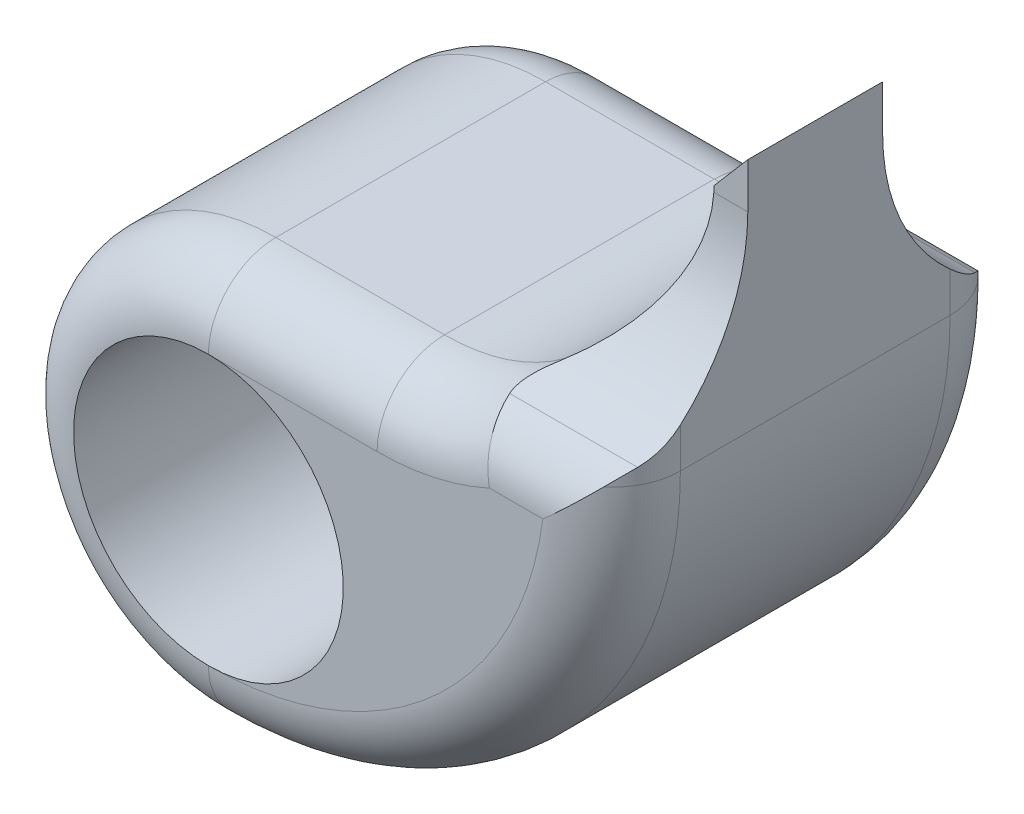
ISO-10303-21;
HEADER;
FILE_DESCRIPTION(('STEP AP214'),'2;1');
FILE_NAME('part.step','',(''),(''),'','','');
FILE_SCHEMA(('AUTOMOTIVE_DESIGN { 1 0 10303 214 1 1 1 1 }'));
ENDSEC;
DATA;
#1=APPLICATION_CONTEXT('core data for automotive mechanical design processes');
#2=APPLICATION_PROTOCOL_DEFINITION('international standard','automotive_design',2000,#1);
#3=PRODUCT_CONTEXT('',#1,'mechanical');
#4=PRODUCT('Part','Part','',(#3));
#5=PRODUCT_RELATED_PRODUCT_CATEGORY('part','',(#4));
#6=PRODUCT_DEFINITION_FORMATION('','',#4);
#7=PRODUCT_DEFINITION_CONTEXT('part definition',#1,'design');
#8=PRODUCT_DEFINITION('design','',#6,#7);
#9=PRODUCT_DEFINITION_SHAPE('','',#8);
#10=(LENGTH_UNIT() NAMED_UNIT(*) SI_UNIT(.MILLI.,.METRE.));
#11=(NAMED_UNIT(*) PLANE_ANGLE_UNIT() SI_UNIT($,.RADIAN.));
#12=(NAMED_UNIT(*) SI_UNIT($,.STERADIAN.) SOLID_ANGLE_UNIT());
#13=UNCERTAINTY_MEASURE_WITH_UNIT(LENGTH_MEASURE(1.E-05),#10,'distance_accuracy_value','');
#14=(GEOMETRIC_REPRESENTATION_CONTEXT(3) GLOBAL_UNCERTAINTY_ASSIGNED_CONTEXT((#13)) GLOBAL_UNIT_ASSIGNED_CONTEXT((#10,
#11,#12)) REPRESENTATION_CONTEXT('',''));
#15=CARTESIAN_POINT('',(0.,0.,0.));
#16=DIRECTION('',(0.,0.,1.));
#17=DIRECTION('',(1.,0.,0.));
#18=AXIS2_PLACEMENT_3D('',#15,#16,#17);
#19=CARTESIAN_POINT('',(6.,6.5,6.));
#20=DIRECTION('',(0.759515470248913,-0.65048923930575,0.));
#21=DIRECTION('',(0.65048923930575,0.759515470248913,0.));
#22=AXIS2_PLACEMENT_3D('',#19,#20,#21);
#23=PLANE('',#22);
#24=DIRECTION('',(0.65048923930575,0.759515470248913,0.));
#25=VECTOR('',#24,1.);
#26=CARTESIAN_POINT('',(6.,6.5,2.));
#27=LINE('',#26,#25);
#28=CARTESIAN_POINT('',(5.5,5.91619674519172,2.));
#29=VERTEX_POINT('',#28);
#30=CARTESIAN_POINT('',(6.,6.5,2.));
#31=VERTEX_POINT('',#30);
#32=EDGE_CURVE('E357',#29,#31,#27,.T.);
#33=ORIENTED_EDGE('',*,*,#32,.F.);
#34=DIRECTION('',(0.,0.,1.));
#35=VECTOR('',#34,1.);
#36=CARTESIAN_POINT('',(5.5,5.91619674519172,2.));
#37=LINE('',#36,#35);
#38=CARTESIAN_POINT('',(5.5,5.91619674519172,4.));
#39=VERTEX_POINT('',#38);
#40=EDGE_CURVE('E210',#29,#39,#37,.T.);
#41=ORIENTED_EDGE('',*,*,#40,.T.);
#42=DIRECTION('',(-0.65048923930575,-0.759515470248913,0.));
#43=VECTOR('',#42,1.);
#44=CARTESIAN_POINT('',(6.,6.5,4.));
#45=LINE('',#44,#43);
#46=CARTESIAN_POINT('',(6.,6.5,4.));
#47=VERTEX_POINT('',#46);
#48=EDGE_CURVE('E358',#47,#39,#45,.T.);
#49=ORIENTED_EDGE('',*,*,#48,.F.);
#50=DIRECTION('',(0.,0.,-1.));
#51=VECTOR('',#50,1.);
#52=CARTESIAN_POINT('',(6.,6.5,6.));
#53=LINE('',#52,#51);
#54=EDGE_CURVE('E254',#47,#31,#53,.T.);
#55=ORIENTED_EDGE('',*,*,#54,.T.);
#56=EDGE_LOOP('',(#33,#41,#49,#55));
#57=FACE_BOUND('',#56,.T.);
#58=ADVANCED_FACE('F36',(#57),#23,.F.);
#59=CARTESIAN_POINT('',(0.,3.,6.));
#60=DIRECTION('',(0.,-1.,0.));
#61=DIRECTION('',(0.,0.,-1.));
#62=AXIS2_PLACEMENT_3D('',#59,#60,#61);
#63=PLANE('',#62);
#64=DIRECTION('',(0.,0.,-1.));
#65=VECTOR('',#64,1.);
#66=CARTESIAN_POINT('',(2.50117072601931,3.,6.));
#67=LINE('',#66,#65);
#68=CARTESIAN_POINT('',(2.50117072601931,3.,5.));
#69=VERTEX_POINT('',#68);
#70=CARTESIAN_POINT('',(2.50117072601931,3.,1.));
#71=VERTEX_POINT('',#70);
#72=EDGE_CURVE('E288',#69,#71,#67,.T.);
#73=ORIENTED_EDGE('',*,*,#72,.T.);
#74=DIRECTION('',(-1.,0.,0.));
#75=VECTOR('',#74,1.);
#76=CARTESIAN_POINT('',(0.,3.,1.));
#77=LINE('',#76,#75);
#78=CARTESIAN_POINT('',(0.,3.,1.));
#79=VERTEX_POINT('',#78);
#80=EDGE_CURVE('E412',#71,#79,#77,.T.);
#81=ORIENTED_EDGE('',*,*,#80,.T.);
#82=DIRECTION('',(0.,0.,-1.));
#83=VECTOR('',#82,1.);
#84=CARTESIAN_POINT('',(0.,3.,6.));
#85=LINE('',#84,#83);
#86=CARTESIAN_POINT('',(0.,3.,5.));
#87=VERTEX_POINT('',#86);
#88=EDGE_CURVE('E279',#87,#79,#85,.T.);
#89=ORIENTED_EDGE('',*,*,#88,.F.);
#90=DIRECTION('',(-1.,0.,0.));
#91=VECTOR('',#90,1.);
#92=CARTESIAN_POINT('',(0.,3.,5.));
#93=LINE('',#92,#91);
#94=EDGE_CURVE('E404',#87,#69,#93,.F.);
#95=ORIENTED_EDGE('',*,*,#94,.T.);
#96=EDGE_LOOP('',(#73,#81,#89,#95));
#97=FACE_BOUND('',#96,.T.);
#98=ADVANCED_FACE('F172',(#97),#63,.F.);
#99=CARTESIAN_POINT('',(0.,0.,6.));
#100=DIRECTION('',(0.,0.,-1.));
#101=DIRECTION('',(-1.,0.,0.));
#102=AXIS2_PLACEMENT_3D('',#99,#100,#101);
#103=CYLINDRICAL_SURFACE('',#102,3.);
#104=ORIENTED_EDGE('',*,*,#88,.T.);
#105=CARTESIAN_POINT('',(0.,0.,1.));
#106=DIRECTION('',(0.,0.,-1.));
#107=DIRECTION('',(-1.,0.,0.));
#108=AXIS2_PLACEMENT_3D('',#105,#106,#107);
#109=CIRCLE('',#108,3.);
#110=CARTESIAN_POINT('',(0.,-3.,1.));
#111=VERTEX_POINT('',#110);
#112=EDGE_CURVE('E490',#79,#111,#109,.F.);
#113=ORIENTED_EDGE('',*,*,#112,.T.);
#114=DIRECTION('',(0.,0.,-1.));
#115=VECTOR('',#114,1.);
#116=CARTESIAN_POINT('',(0.,-3.,6.));
#117=LINE('',#116,#115);
#118=CARTESIAN_POINT('',(0.,-3.,5.));
#119=VERTEX_POINT('',#118);
#120=EDGE_CURVE('E276',#119,#111,#117,.T.);
#121=ORIENTED_EDGE('',*,*,#120,.F.);
#122=CARTESIAN_POINT('',(0.,0.,5.));
#123=DIRECTION('',(0.,0.,-1.));
#124=DIRECTION('',(-1.,0.,0.));
#125=AXIS2_PLACEMENT_3D('',#122,#123,#124);
#126=CIRCLE('',#125,3.);
#127=EDGE_CURVE('E488',#119,#87,#126,.T.);
#128=ORIENTED_EDGE('',*,*,#127,.T.);
#129=EDGE_LOOP('',(#104,#113,#121,#128));
#130=FACE_BOUND('',#129,.T.);
#131=ADVANCED_FACE('F178',(#130),#103,.T.);
#132=CARTESIAN_POINT('',(6.,3.,6.));
#133=DIRECTION('',(-1.,0.,0.));
#134=DIRECTION('',(0.,0.,1.));
#135=AXIS2_PLACEMENT_3D('',#132,#133,#134);
#136=PLANE('',#135);
#137=DIRECTION('',(0.,0.,-1.));
#138=VECTOR('',#137,1.);
#139=CARTESIAN_POINT('',(6.,3.,6.));
#140=LINE('',#139,#138);
#141=CARTESIAN_POINT('',(6.,3.,5.));
#142=VERTEX_POINT('',#141);
#143=CARTESIAN_POINT('',(6.,3.,1.));
#144=VERTEX_POINT('',#143);
#145=EDGE_CURVE('E282',#142,#144,#140,.T.);
#146=ORIENTED_EDGE('',*,*,#145,.T.);
#147=DIRECTION('',(0.,-1.,0.));
#148=VECTOR('',#147,1.);
#149=CARTESIAN_POINT('',(6.,3.,1.));
#150=LINE('',#149,#148);
#151=CARTESIAN_POINT('',(6.,3.5923591472464,1.));
#152=VERTEX_POINT('',#151);
#153=EDGE_CURVE('E349',#144,#152,#150,.F.);
#154=ORIENTED_EDGE('',*,*,#153,.T.);
#155=CARTESIAN_POINT('',(6.,5.82842712474619,-1.));
#156=DIRECTION('',(-1.,0.,0.));
#157=DIRECTION('',(0.,0.,1.));
#158=AXIS2_PLACEMENT_3D('',#155,#156,#157);
#159=CIRCLE('',#158,3.);
#160=CARTESIAN_POINT('',(6.,5.82842712474619,2.));
#161=VERTEX_POINT('',#160);
#162=EDGE_CURVE('E299',#152,#161,#159,.T.);
#163=ORIENTED_EDGE('',*,*,#162,.T.);
#164=DIRECTION('',(0.,-1.,0.));
#165=VECTOR('',#164,1.);
#166=CARTESIAN_POINT('',(6.,3.,2.));
#167=LINE('',#166,#165);
#168=EDGE_CURVE('E346',#31,#161,#167,.T.);
#169=ORIENTED_EDGE('',*,*,#168,.F.);
#170=ORIENTED_EDGE('',*,*,#54,.F.);
#171=DIRECTION('',(0.,1.,0.));
#172=VECTOR('',#171,1.);
#173=CARTESIAN_POINT('',(6.,3.,4.));
#174=LINE('',#173,#172);
#175=CARTESIAN_POINT('',(6.,5.82842712474619,4.));
#176=VERTEX_POINT('',#175);
#177=EDGE_CURVE('E379',#176,#47,#174,.T.);
#178=ORIENTED_EDGE('',*,*,#177,.F.);
#179=CARTESIAN_POINT('',(6.,5.82842712474619,7.));
#180=DIRECTION('',(-1.,0.,0.));
#181=DIRECTION('',(0.,0.,1.));
#182=AXIS2_PLACEMENT_3D('',#179,#180,#181);
#183=CIRCLE('',#182,3.);
#184=CARTESIAN_POINT('',(6.,3.5923591472464,5.));
#185=VERTEX_POINT('',#184);
#186=EDGE_CURVE('E320',#176,#185,#183,.T.);
#187=ORIENTED_EDGE('',*,*,#186,.T.);
#188=DIRECTION('',(0.,1.,0.));
#189=VECTOR('',#188,1.);
#190=CARTESIAN_POINT('',(6.,3.,5.));
#191=LINE('',#190,#189);
#192=EDGE_CURVE('E469',#185,#142,#191,.F.);
#193=ORIENTED_EDGE('',*,*,#192,.T.);
#194=EDGE_LOOP('',(#146,#154,#163,#169,#170,#178,#187,#193));
#195=FACE_BOUND('',#194,.T.);
#196=ADVANCED_FACE('F343',(#195),#136,.F.);
#197=CARTESIAN_POINT('',(0.,0.,6.));
#198=DIRECTION('',(0.,0.,-1.));
#199=DIRECTION('',(-1.,0.,0.));
#200=AXIS2_PLACEMENT_3D('',#197,#198,#199);
#201=PLANE('',#200);
#202=CARTESIAN_POINT('',(2.50117072601931,6.,6.));
#203=DIRECTION('',(0.,0.,-1.));
#204=DIRECTION('',(-1.,0.,0.));
#205=AXIS2_PLACEMENT_3D('',#202,#203,#204);
#206=CIRCLE('',#205,4.);
#207=CARTESIAN_POINT('',(4.16906490728983,2.36432550960844,6.));
#208=VERTEX_POINT('',#207);
#209=CARTESIAN_POINT('',(2.50117072601931,2.,6.));
#210=VERTEX_POINT('',#209);
#211=EDGE_CURVE('E424',#208,#210,#206,.T.);
#212=ORIENTED_EDGE('',*,*,#211,.T.);
#213=DIRECTION('',(-1.,0.,0.));
#214=VECTOR('',#213,1.);
#215=CARTESIAN_POINT('',(0.,2.,6.));
#216=LINE('',#215,#214);
#217=CARTESIAN_POINT('',(0.,2.,6.));
#218=VERTEX_POINT('',#217);
#219=EDGE_CURVE('E401',#210,#218,#216,.T.);
#220=ORIENTED_EDGE('',*,*,#219,.T.);
#221=CARTESIAN_POINT('',(0.,0.,6.));
#222=DIRECTION('',(0.,0.,1.));
#223=DIRECTION('',(1.,0.,0.));
#224=AXIS2_PLACEMENT_3D('',#221,#222,#223);
#225=CIRCLE('',#224,2.);
#226=CARTESIAN_POINT('',(0.,-2.,6.));
#227=VERTEX_POINT('',#226);
#228=EDGE_CURVE('E270',#227,#218,#225,.T.);
#229=ORIENTED_EDGE('',*,*,#228,.F.);
#230=CARTESIAN_POINT('',(0.,3.,6.));
#231=DIRECTION('',(0.,0.,-1.));
#232=DIRECTION('',(-1.,0.,0.));
#233=AXIS2_PLACEMENT_3D('',#230,#231,#232);
#234=CIRCLE('',#233,5.);
#235=CARTESIAN_POINT('',(4.95942717884489,2.36432550960844,6.));
#236=VERTEX_POINT('',#235);
#237=EDGE_CURVE('E422',#227,#236,#234,.F.);
#238=ORIENTED_EDGE('',*,*,#237,.T.);
#239=DIRECTION('',(1.,0.,0.));
#240=VECTOR('',#239,1.);
#241=CARTESIAN_POINT('',(0.,2.36432550960844,6.));
#242=LINE('',#241,#240);
#243=EDGE_CURVE('E99',#236,#208,#242,.F.);
#244=ORIENTED_EDGE('',*,*,#243,.T.);
#245=EDGE_LOOP('',(#212,#220,#229,#238,#244));
#246=FACE_BOUND('',#245,.T.);
#247=ADVANCED_FACE('F425',(#246),#201,.F.);
#248=CARTESIAN_POINT('',(0.,0.,0.));
#249=DIRECTION('',(0.,0.,-1.));
#250=DIRECTION('',(-1.,0.,0.));
#251=AXIS2_PLACEMENT_3D('',#248,#249,#250);
#252=PLANE('',#251);
#253=DIRECTION('',(-1.,0.,0.));
#254=VECTOR('',#253,1.);
#255=CARTESIAN_POINT('',(6.,2.36432550960844,0.));
#256=LINE('',#255,#254);
#257=CARTESIAN_POINT('',(4.16906490728982,2.36432550960844,0.));
#258=VERTEX_POINT('',#257);
#259=CARTESIAN_POINT('',(4.95942717884489,2.36432550960844,0.));
#260=VERTEX_POINT('',#259);
#261=EDGE_CURVE('E211',#258,#260,#256,.F.);
#262=ORIENTED_EDGE('',*,*,#261,.T.);
#263=CARTESIAN_POINT('',(0.,3.,0.));
#264=DIRECTION('',(0.,0.,-1.));
#265=DIRECTION('',(-1.,0.,0.));
#266=AXIS2_PLACEMENT_3D('',#263,#264,#265);
#267=CIRCLE('',#266,5.);
#268=CARTESIAN_POINT('',(0.,-2.,0.));
#269=VERTEX_POINT('',#268);
#270=EDGE_CURVE('E239',#260,#269,#267,.T.);
#271=ORIENTED_EDGE('',*,*,#270,.T.);
#272=CARTESIAN_POINT('',(0.,0.,0.));
#273=DIRECTION('',(0.,0.,1.));
#274=DIRECTION('',(1.,0.,0.));
#275=AXIS2_PLACEMENT_3D('',#272,#273,#274);
#276=CIRCLE('',#275,2.);
#277=CARTESIAN_POINT('',(0.,2.,0.));
#278=VERTEX_POINT('',#277);
#279=EDGE_CURVE('E255',#269,#278,#276,.T.);
#280=ORIENTED_EDGE('',*,*,#279,.T.);
#281=DIRECTION('',(-1.,0.,0.));
#282=VECTOR('',#281,1.);
#283=CARTESIAN_POINT('',(2.50117072601931,2.,0.));
#284=LINE('',#283,#282);
#285=CARTESIAN_POINT('',(2.50117072601931,2.,0.));
#286=VERTEX_POINT('',#285);
#287=EDGE_CURVE('E264',#278,#286,#284,.F.);
#288=ORIENTED_EDGE('',*,*,#287,.T.);
#289=CARTESIAN_POINT('',(2.50117072601931,6.,0.));
#290=DIRECTION('',(0.,0.,-1.));
#291=DIRECTION('',(-1.,0.,0.));
#292=AXIS2_PLACEMENT_3D('',#289,#290,#291);
#293=CIRCLE('',#292,4.);
#294=EDGE_CURVE('E499',#286,#258,#293,.F.);
#295=ORIENTED_EDGE('',*,*,#294,.T.);
#296=EDGE_LOOP('',(#262,#271,#280,#288,#295));
#297=FACE_BOUND('',#296,.T.);
#298=ADVANCED_FACE('F260',(#297),#252,.T.);
#299=CARTESIAN_POINT('',(0.,0.,6.));
#300=DIRECTION('',(0.,0.,1.));
#301=DIRECTION('',(1.,0.,0.));
#302=AXIS2_PLACEMENT_3D('',#299,#300,#301);
#303=CYLINDRICAL_SURFACE('',#302,2.);
#304=EDGE_CURVE('E249',#278,#269,#276,.T.);
#305=ORIENTED_EDGE('',*,*,#304,.F.);
#306=ORIENTED_EDGE('',*,*,#279,.F.);
#307=EDGE_LOOP('',(#305,#306));
#308=FACE_BOUND('',#307,.T.);
#309=EDGE_CURVE('E268',#218,#227,#225,.T.);
#310=ORIENTED_EDGE('',*,*,#309,.T.);
#311=ORIENTED_EDGE('',*,*,#228,.T.);
#312=EDGE_LOOP('',(#310,#311));
#313=FACE_BOUND('',#312,.T.);
#314=ADVANCED_FACE('F266',(#308,#313),#303,.F.);
#315=CARTESIAN_POINT('',(0.,0.,4.));
#316=DIRECTION('',(0.,0.,1.));
#317=DIRECTION('',(1.,0.,0.));
#318=AXIS2_PLACEMENT_3D('',#315,#316,#317);
#319=PLANE('',#318);
#320=CARTESIAN_POINT('',(2.50117072601931,6.,4.));
#321=DIRECTION('',(0.,0.,1.));
#322=DIRECTION('',(1.,0.,0.));
#323=AXIS2_PLACEMENT_3D('',#320,#321,#322);
#324=CIRCLE('',#323,3.);
#325=CARTESIAN_POINT('',(5.49626049904401,5.82842712474619,4.));
#326=VERTEX_POINT('',#325);
#327=EDGE_CURVE('E330',#39,#326,#324,.F.);
#328=ORIENTED_EDGE('',*,*,#327,.T.);
#329=CARTESIAN_POINT('',(5.49626049904401,5.82842712474619,4.));
#330=CARTESIAN_POINT('',(5.5,5.82842712474619,4.));
#331=B_SPLINE_CURVE_WITH_KNOTS('',1,(#329,#330),.UNSPECIFIED.,.F.,.F.,(2,2),(0.,1.),.UNSPECIFIED.);
#332=CARTESIAN_POINT('',(5.5,5.82842712474619,4.));
#333=VERTEX_POINT('',#332);
#334=EDGE_CURVE('E316',#326,#333,#331,.T.);
#335=ORIENTED_EDGE('',*,*,#334,.T.);
#336=DIRECTION('',(-1.,0.,0.));
#337=VECTOR('',#336,1.);
#338=CARTESIAN_POINT('',(6.,5.82842712474619,4.));
#339=LINE('',#338,#337);
#340=EDGE_CURVE('E291',#333,#176,#339,.F.);
#341=ORIENTED_EDGE('',*,*,#340,.T.);
#342=ORIENTED_EDGE('',*,*,#177,.T.);
#343=ORIENTED_EDGE('',*,*,#48,.T.);
#344=EDGE_LOOP('',(#328,#335,#341,#342,#343));
#345=FACE_BOUND('',#344,.T.);
#346=ADVANCED_FACE('F309',(#345),#319,.T.);
#347=CARTESIAN_POINT('',(0.,0.,2.));
#348=DIRECTION('',(0.,0.,1.));
#349=DIRECTION('',(1.,0.,0.));
#350=AXIS2_PLACEMENT_3D('',#347,#348,#349);
#351=PLANE('',#350);
#352=ORIENTED_EDGE('',*,*,#168,.T.);
#353=DIRECTION('',(1.,0.,0.));
#354=VECTOR('',#353,1.);
#355=CARTESIAN_POINT('',(0.,5.82842712474619,2.));
#356=LINE('',#355,#354);
#357=CARTESIAN_POINT('',(5.5,5.82842712474619,2.));
#358=VERTEX_POINT('',#357);
#359=EDGE_CURVE('E285',#161,#358,#356,.F.);
#360=ORIENTED_EDGE('',*,*,#359,.T.);
#361=CARTESIAN_POINT('',(5.5,5.82842712474619,2.));
#362=CARTESIAN_POINT('',(5.49626049904401,5.82842712474619,2.));
#363=B_SPLINE_CURVE_WITH_KNOTS('',1,(#361,#362),.UNSPECIFIED.,.F.,.F.,(2,2),(0.,1.),.UNSPECIFIED.);
#364=CARTESIAN_POINT('',(5.49626049904401,5.82842712474619,2.));
#365=VERTEX_POINT('',#364);
#366=EDGE_CURVE('E294',#358,#365,#363,.T.);
#367=ORIENTED_EDGE('',*,*,#366,.T.);
#368=CARTESIAN_POINT('',(2.50117072601931,6.,2.));
#369=DIRECTION('',(0.,0.,1.));
#370=DIRECTION('',(1.,0.,0.));
#371=AXIS2_PLACEMENT_3D('',#368,#369,#370);
#372=CIRCLE('',#371,3.);
#373=EDGE_CURVE('E328',#365,#29,#372,.T.);
#374=ORIENTED_EDGE('',*,*,#373,.T.);
#375=ORIENTED_EDGE('',*,*,#32,.T.);
#376=EDGE_LOOP('',(#352,#360,#367,#374,#375));
#377=FACE_BOUND('',#376,.T.);
#378=ADVANCED_FACE('F188',(#377),#351,.F.);
#379=CARTESIAN_POINT('',(0.,3.,6.));
#380=DIRECTION('',(0.,0.,-1.));
#381=DIRECTION('',(-1.,0.,0.));
#382=AXIS2_PLACEMENT_3D('',#379,#380,#381);
#383=CYLINDRICAL_SURFACE('',#382,6.);
#384=ORIENTED_EDGE('',*,*,#120,.T.);
#385=CARTESIAN_POINT('',(0.,3.,1.));
#386=DIRECTION('',(0.,0.,-1.));
#387=DIRECTION('',(-1.,0.,0.));
#388=AXIS2_PLACEMENT_3D('',#385,#386,#387);
#389=CIRCLE('',#388,6.);
#390=EDGE_CURVE('E242',#111,#144,#389,.F.);
#391=ORIENTED_EDGE('',*,*,#390,.T.);
#392=ORIENTED_EDGE('',*,*,#145,.F.);
#393=CARTESIAN_POINT('',(0.,3.,5.));
#394=DIRECTION('',(0.,0.,-1.));
#395=DIRECTION('',(-1.,0.,0.));
#396=AXIS2_PLACEMENT_3D('',#393,#394,#395);
#397=CIRCLE('',#396,6.);
#398=EDGE_CURVE('E87',#142,#119,#397,.T.);
#399=ORIENTED_EDGE('',*,*,#398,.T.);
#400=EDGE_LOOP('',(#384,#391,#392,#399));
#401=FACE_BOUND('',#400,.T.);
#402=ADVANCED_FACE('F184',(#401),#383,.T.);
#403=CARTESIAN_POINT('',(0.,5.82842712474619,7.));
#404=DIRECTION('',(1.,0.,0.));
#405=DIRECTION('',(0.,0.,-1.));
#406=AXIS2_PLACEMENT_3D('',#403,#404,#405);
#407=CYLINDRICAL_SURFACE('',#406,3.);
#408=CARTESIAN_POINT('',(5.49626049904401,5.82842712474619,4.));
#409=CARTESIAN_POINT('',(5.49236138137416,5.76005868116705,3.99998292122645));
#410=CARTESIAN_POINT('',(5.48608842961939,5.6918437749052,4.00233645326493));
#411=CARTESIAN_POINT('',(5.46896742006069,5.55636412944692,4.01159570386934));
#412=CARTESIAN_POINT('',(5.45812356713895,5.48909857554668,4.0184972418939));
#413=CARTESIAN_POINT('',(5.43214209929666,5.3566273253393,4.03658299037899));
#414=CARTESIAN_POINT('',(5.41704369951255,5.29140859723063,4.04772839924133));
#415=CARTESIAN_POINT('',(5.38277887062217,5.162883575377,4.07401978124023));
#416=CARTESIAN_POINT('',(5.36361170138401,5.09957763197487,4.08916648235689));
#417=CARTESIAN_POINT('',(5.300589625948,4.91358031765478,4.14001815675169));
#418=CARTESIAN_POINT('',(5.2510963729921,4.79422687886604,4.18121860908084));
#419=CARTESIAN_POINT('',(5.139571784955,4.5664672095054,4.27552883651622));
#420=CARTESIAN_POINT('',(5.07751001425435,4.45808852952008,4.32866755587019));
#421=CARTESIAN_POINT('',(4.91417421863919,4.20885605219837,4.46911981886819));
#422=CARTESIAN_POINT('',(4.80755114883776,4.07423481079889,4.56127305618303));
#423=CARTESIAN_POINT('',(4.57866177848465,3.82922135908474,4.75770108885761));
#424=CARTESIAN_POINT('',(4.45636434475465,3.71887859010521,4.8619999697357));
#425=CARTESIAN_POINT('',(4.26176460476874,3.56952220496748,5.0244090072436));
#426=CARTESIAN_POINT('',(4.1940473088293,3.52190330418385,5.0803347277543));
#427=CARTESIAN_POINT('',(4.05537775015989,3.4326583550278,5.19294494427319));
#428=CARTESIAN_POINT('',(3.98442618842421,3.3910310161005,5.24962927399679));
#429=CARTESIAN_POINT('',(3.83927385002027,3.31369413486581,5.36268458342955));
#430=CARTESIAN_POINT('',(3.76507643959489,3.27797863714324,5.41905582251039));
#431=CARTESIAN_POINT('',(3.61298282993296,3.21239661623222,5.53012546827438));
#432=CARTESIAN_POINT('',(3.53508890984894,3.18252654568668,5.58482487241247));
#433=CARTESIAN_POINT('',(3.37975418495986,3.13043868021929,5.68701374217083));
#434=CARTESIAN_POINT('',(3.3025934274793,3.10785758215455,5.73474031250985));
#435=CARTESIAN_POINT('',(3.14303243704253,3.06831806278928,5.82350579508576));
#436=CARTESIAN_POINT('',(3.06063747599818,3.05135408764782,5.86455129258308));
#437=CARTESIAN_POINT('',(2.91359675203832,3.02783316840285,5.92417441105572));
#438=CARTESIAN_POINT('',(2.85049389885598,3.01969060766193,5.94582396977215));
#439=CARTESIAN_POINT('',(2.72142955240894,3.0074058359579,5.97912740713545));
#440=CARTESIAN_POINT('',(2.6554827352945,3.0032451777542,5.9908273516735));
#441=CARTESIAN_POINT('',(2.55980697850404,3.0004256190049,5.99880416946711));
#442=CARTESIAN_POINT('',(2.53049410683455,2.99999013404954,6.00004991382805));
#443=CARTESIAN_POINT('',(2.50117072601931,3.,6.));
#444=B_SPLINE_CURVE_WITH_KNOTS('',3,(#408,#409,#410,#411,#412,#413,#414,#415,#416,#417,#418,
#419,#420,#421,#422,#423,#424,#425,#426,#427,#428,#429,#430,#431,#432,#433,#434,#435,#436,#437,
#438,#439,#440,#441,#442,#443),.UNSPECIFIED.,.F.,.F.,(4,2,2,2,2,2,2,2,2,2,2,2,2,2,2,2,2,4),(0.,
0.205329693293322,0.410470909665819,0.613779890411814,0.817125885937464,1.22204106264711,
1.62794875580942,2.2094455369688,2.79211575349435,3.09163804498391,3.39109572388961,
3.69024987742827,3.9892219193729,4.26937685188125,4.54925395272506,4.75024658962254,
4.95030350061546,5.03823742796051),.UNSPECIFIED.);
#445=CARTESIAN_POINT('',(4.29093761702891,3.59235914724601,5.00000000000005));
#446=VERTEX_POINT('',#445);
#447=EDGE_CURVE('E204',#446,#326,#444,.F.);
#448=ORIENTED_EDGE('',*,*,#447,.F.);
#449=CARTESIAN_POINT('',(4.29093761702856,3.5923591472466,5.));
#450=CARTESIAN_POINT('',(4.26426265038584,3.57248134527772,5.02223792086786));
#451=CARTESIAN_POINT('',(4.23790218130022,3.55269737668581,5.04501067630828));
#452=CARTESIAN_POINT('',(4.18611297197173,3.51284706403349,5.09236393610136));
#453=CARTESIAN_POINT('',(4.16070446000956,3.49278099427966,5.11696664115897));
#454=CARTESIAN_POINT('',(4.10980564956487,3.45069608545077,5.17034104001207));
#455=CARTESIAN_POINT('',(4.08450948579677,3.42866244899577,5.19928888851081));
#456=CARTESIAN_POINT('',(4.03845196148406,3.38420591039355,5.26011782866472));
#457=CARTESIAN_POINT('',(4.01765805710126,3.36178715946466,5.29197532855557));
#458=CARTESIAN_POINT('',(3.99233072648735,3.32710122620456,5.34354999227403));
#459=CARTESIAN_POINT('',(3.98475855928991,3.31504893795774,5.36188068654297));
#460=CARTESIAN_POINT('',(3.97303493625917,3.29104983234091,5.39931254169769));
#461=CARTESIAN_POINT('',(3.96883145522735,3.27910434588406,5.41839700898368));
#462=CARTESIAN_POINT('',(3.96566147625159,3.26104844784646,5.44799793073341));
#463=CARTESIAN_POINT('',(3.96515863202592,3.25484927209917,5.45829960715155));
#464=CARTESIAN_POINT('',(3.96543963323181,3.24251586557689,5.47907535040745));
#465=CARTESIAN_POINT('',(3.96623765829681,3.23638309390305,5.48955006848411));
#466=CARTESIAN_POINT('',(3.96774520649441,3.23035091339287,5.5));
#467=B_SPLINE_CURVE_WITH_KNOTS('',3,(#449,#450,#451,#452,#453,#454,#455,#456,#457,#458,#459,
#460,#461,#462,#463,#464,#465,#466),.UNSPECIFIED.,.F.,.F.,(4,2,2,2,2,2,2,2,4),(0.,
0.120105715169025,0.24203535140059,0.374820922201772,0.506612016005824,0.57605565756248,
0.644404964571262,0.68044163463133,0.716873741792312),.UNSPECIFIED.);
#468=CARTESIAN_POINT('',(3.96774520649441,3.23035091339287,5.5));
#469=VERTEX_POINT('',#468);
#470=EDGE_CURVE('E11',#446,#469,#467,.T.);
#471=ORIENTED_EDGE('',*,*,#470,.T.);
#472=DIRECTION('',(1.,0.,0.));
#473=VECTOR('',#472,1.);
#474=CARTESIAN_POINT('',(0.,3.23035091339287,5.5));
#475=LINE('',#474,#473);
#476=CARTESIAN_POINT('',(5.86602540378449,3.23035091339287,5.5));
#477=VERTEX_POINT('',#476);
#478=EDGE_CURVE('E55',#469,#477,#475,.T.);
#479=ORIENTED_EDGE('',*,*,#478,.T.);
#480=CARTESIAN_POINT('',(5.86602540378449,3.23035091339288,5.5));
#481=CARTESIAN_POINT('',(5.88154238236497,3.24586194804985,5.47312662632835));
#482=CARTESIAN_POINT('',(5.89559405171349,3.26214440758727,5.44589641166632));
#483=CARTESIAN_POINT('',(5.9208562628336,3.29616088546812,5.39106730236851));
#484=CARTESIAN_POINT('',(5.93206957728158,3.31389346466208,5.36346879547102));
#485=CARTESIAN_POINT('',(5.96123162565486,3.36843796076301,5.28166620969494));
#486=CARTESIAN_POINT('',(5.97531425432611,3.40722580376958,5.22735185168078));
#487=CARTESIAN_POINT('',(5.98997053509388,3.47081995714591,5.14444369895177));
#488=CARTESIAN_POINT('',(5.99376823507948,3.49413984503911,5.11518987465206));
#489=CARTESIAN_POINT('',(5.99879480176038,3.54223500825791,5.05712540675718));
#490=CARTESIAN_POINT('',(5.99999505885074,3.56702343305372,5.02832313403239));
#491=CARTESIAN_POINT('',(6.,3.5923591472464,5.));
#492=B_SPLINE_CURVE_WITH_KNOTS('',3,(#480,#481,#482,#483,#484,#485,#486,#487,#488,#489,#490,
#491),.UNSPECIFIED.,.F.,.F.,(4,2,2,2,2,4),(0.,0.103976758370557,0.207851550537422,
0.411431518668696,0.52414906425712,0.638101951910164),.UNSPECIFIED.);
#493=EDGE_CURVE('E47',#477,#185,#492,.T.);
#494=ORIENTED_EDGE('',*,*,#493,.T.);
#495=ORIENTED_EDGE('',*,*,#186,.F.);
#496=ORIENTED_EDGE('',*,*,#340,.F.);
#497=ORIENTED_EDGE('',*,*,#334,.F.);
#498=EDGE_LOOP('',(#448,#471,#479,#494,#495,#496,#497));
#499=FACE_BOUND('',#498,.T.);
#500=ADVANCED_FACE('F187',(#499),#407,.F.);
#501=CARTESIAN_POINT('',(2.50117072601931,6.,2.));
#502=DIRECTION('',(0.,0.,-1.));
#503=DIRECTION('',(-1.,0.,0.));
#504=AXIS2_PLACEMENT_3D('',#501,#502,#503);
#505=CYLINDRICAL_SURFACE('',#504,3.);
#506=CARTESIAN_POINT('',(5.49626049904401,5.82842712474619,2.));
#507=CARTESIAN_POINT('',(5.49236138137416,5.76005868116704,2.00001707877355));
#508=CARTESIAN_POINT('',(5.48608842961939,5.6918437749052,1.99766354673507));
#509=CARTESIAN_POINT('',(5.46896742006069,5.55636412944692,1.98840429613066));
#510=CARTESIAN_POINT('',(5.45812356713895,5.48909857554668,1.9815027581061));
#511=CARTESIAN_POINT('',(5.43214209929666,5.3566273253393,1.96341700962101));
#512=CARTESIAN_POINT('',(5.41704369951255,5.29140859723063,1.95227160075867));
#513=CARTESIAN_POINT('',(5.38277887062217,5.162883575377,1.92598021875977));
#514=CARTESIAN_POINT('',(5.36361170138401,5.09957763197487,1.9108335176431));
#515=CARTESIAN_POINT('',(5.300589625948,4.91358031765478,1.85998184324831));
#516=CARTESIAN_POINT('',(5.2510963729921,4.79422687886604,1.81878139091916));
#517=CARTESIAN_POINT('',(5.139571784955,4.5664672095054,1.72447116348378));
#518=CARTESIAN_POINT('',(5.07751001425435,4.45808852952008,1.67133244412981));
#519=CARTESIAN_POINT('',(4.91417421863919,4.20885605219837,1.53088018113181));
#520=CARTESIAN_POINT('',(4.80755114883776,4.07423481079888,1.43872694381697));
#521=CARTESIAN_POINT('',(4.57866177848464,3.82922135908473,1.24229891114239));
#522=CARTESIAN_POINT('',(4.45636434475465,3.7188785901052,1.13800003026429));
#523=CARTESIAN_POINT('',(4.26176460476873,3.56952220496748,0.975590992756397));
#524=CARTESIAN_POINT('',(4.19404730882929,3.52190330418385,0.919665272245701));
#525=CARTESIAN_POINT('',(4.05537775015989,3.4326583550278,0.807055055726802));
#526=CARTESIAN_POINT('',(3.98442618842421,3.39103101610049,0.750370726003205));
#527=CARTESIAN_POINT('',(3.83927385002026,3.31369413486581,0.637315416570447));
#528=CARTESIAN_POINT('',(3.76507643959489,3.27797863714324,0.58094417748961));
#529=CARTESIAN_POINT('',(3.61298282993295,3.21239661623222,0.469874531725612));
#530=CARTESIAN_POINT('',(3.53508890984894,3.18252654568668,0.41517512758753));
#531=CARTESIAN_POINT('',(3.37975418495985,3.13043868021929,0.312986257829166));
#532=CARTESIAN_POINT('',(3.3025934274793,3.10785758215455,0.265259687490148));
#533=CARTESIAN_POINT('',(3.14303243704252,3.06831806278928,0.176494204914242));
#534=CARTESIAN_POINT('',(3.06063747599817,3.05135408764782,0.135448707416922));
#535=CARTESIAN_POINT('',(2.91359675203832,3.02783316840285,0.0758255889442805));
#536=CARTESIAN_POINT('',(2.85049389885598,3.01969060766193,0.0541760302278524));
#537=CARTESIAN_POINT('',(2.72142955240893,3.0074058359579,0.0208725928645511));
#538=CARTESIAN_POINT('',(2.65548273529449,3.0032451777542,0.00917264832650766));
#539=CARTESIAN_POINT('',(2.55980697850404,3.0004256190049,0.00119583053289401));
#540=CARTESIAN_POINT('',(2.53049410683454,2.99999013404954,-4.99138280432222E-05));
#541=CARTESIAN_POINT('',(2.50117072601931,3.,0.));
#542=B_SPLINE_CURVE_WITH_KNOTS('',3,(#506,#507,#508,#509,#510,#511,#512,#513,#514,#515,#516,
#517,#518,#519,#520,#521,#522,#523,#524,#525,#526,#527,#528,#529,#530,#531,#532,#533,#534,#535,
#536,#537,#538,#539,#540,#541),.UNSPECIFIED.,.F.,.F.,(4,2,2,2,2,2,2,2,2,2,2,2,2,2,2,2,2,4),(0.,
0.205329693293323,0.410470909665819,0.613779890411814,0.817125885937465,1.22204106264711,
1.62794875580943,2.2094455369688,2.79211575349435,3.09163804498391,3.39109572388961,
3.69024987742828,3.98922191937291,4.26937685188125,4.54925395272506,4.75024658962254,
4.95030350061546,5.0382374279605),.UNSPECIFIED.);
#543=CARTESIAN_POINT('',(4.29093761702891,3.592359147246,0.999999999999952));
#544=VERTEX_POINT('',#543);
#545=EDGE_CURVE('E135',#544,#365,#542,.F.);
#546=ORIENTED_EDGE('',*,*,#545,.F.);
#547=CARTESIAN_POINT('',(2.50117072601931,6.,1.));
#548=DIRECTION('',(0.,0.,-1.));
#549=DIRECTION('',(-1.,0.,0.));
#550=AXIS2_PLACEMENT_3D('',#547,#548,#549);
#551=CIRCLE('',#550,3.);
#552=EDGE_CURVE('E413',#544,#71,#551,.T.);
#553=ORIENTED_EDGE('',*,*,#552,.T.);
#554=ORIENTED_EDGE('',*,*,#72,.F.);
#555=CARTESIAN_POINT('',(2.50117072601931,6.,5.));
#556=DIRECTION('',(0.,0.,-1.));
#557=DIRECTION('',(-1.,0.,0.));
#558=AXIS2_PLACEMENT_3D('',#555,#556,#557);
#559=CIRCLE('',#558,3.);
#560=EDGE_CURVE('E417',#69,#446,#559,.F.);
#561=ORIENTED_EDGE('',*,*,#560,.T.);
#562=ORIENTED_EDGE('',*,*,#447,.T.);
#563=ORIENTED_EDGE('',*,*,#327,.F.);
#564=ORIENTED_EDGE('',*,*,#40,.F.);
#565=ORIENTED_EDGE('',*,*,#373,.F.);
#566=EDGE_LOOP('',(#546,#553,#554,#561,#562,#563,#564,#565));
#567=FACE_BOUND('',#566,.T.);
#568=ADVANCED_FACE('F190',(#567),#505,.F.);
#569=CARTESIAN_POINT('',(0.,5.82842712474619,-1.));
#570=DIRECTION('',(1.,0.,0.));
#571=DIRECTION('',(0.,0.,-1.));
#572=AXIS2_PLACEMENT_3D('',#569,#570,#571);
#573=CYLINDRICAL_SURFACE('',#572,3.);
#574=ORIENTED_EDGE('',*,*,#162,.F.);
#575=CARTESIAN_POINT('',(6.,3.5923591472464,1.));
#576=CARTESIAN_POINT('',(6.00000183915626,3.56358382326248,0.967844760287353));
#577=CARTESIAN_POINT('',(5.99844815602703,3.53549607563039,0.935029246662066));
#578=CARTESIAN_POINT('',(5.99186213358564,3.48084014979534,0.868336681009102));
#579=CARTESIAN_POINT('',(5.98681949928682,3.45427672133448,0.834456771400569));
#580=CARTESIAN_POINT('',(5.97307253093673,3.40368217254099,0.767015770324037));
#581=CARTESIAN_POINT('',(5.96447114945993,3.37960193034431,0.733470927243114));
#582=CARTESIAN_POINT('',(5.94334122600612,3.33342511355032,0.666319151089105));
#583=CARTESIAN_POINT('',(5.93081950973815,3.31132517640675,0.632712426097307));
#584=CARTESIAN_POINT('',(5.90893945007987,3.27979379151592,0.582674351264645));
#585=CARTESIAN_POINT('',(5.90113200056299,3.26955525190714,0.566060772859626));
#586=CARTESIAN_POINT('',(5.88441004364542,3.2495629327929,0.532917792919726));
#587=CARTESIAN_POINT('',(5.87548834640012,3.239812937351,0.516389739094853));
#588=CARTESIAN_POINT('',(5.86602540378512,3.23035091339257,0.499999999999919));
#589=B_SPLINE_CURVE_WITH_KNOTS('',3,(#575,#576,#577,#578,#579,#580,#581,#582,#583,#584,#585,
#586,#587,#588),.UNSPECIFIED.,.F.,.F.,(4,2,2,2,2,2,4),(0.,0.129465401802913,0.259314460667892,
0.385644044114416,0.511754886517755,0.574781326953553,0.638237787434529),.UNSPECIFIED.);
#590=CARTESIAN_POINT('',(5.86602540378449,3.23035091339287,0.5));
#591=VERTEX_POINT('',#590);
#592=EDGE_CURVE('E483',#152,#591,#589,.T.);
#593=ORIENTED_EDGE('',*,*,#592,.T.);
#594=DIRECTION('',(1.,0.,0.));
#595=VECTOR('',#594,1.);
#596=CARTESIAN_POINT('',(0.,3.23035091339287,0.5));
#597=LINE('',#596,#595);
#598=CARTESIAN_POINT('',(3.96774520649441,3.23035091339287,0.5));
#599=VERTEX_POINT('',#598);
#600=EDGE_CURVE('E472',#591,#599,#597,.F.);
#601=ORIENTED_EDGE('',*,*,#600,.T.);
#602=CARTESIAN_POINT('',(3.96774520649441,3.23035091339287,0.5));
#603=CARTESIAN_POINT('',(3.96467226391659,3.24240037180749,0.520893619960494));
#604=CARTESIAN_POINT('',(3.96453762274079,3.25478167780789,0.541734903987469));
#605=CARTESIAN_POINT('',(3.96892840793293,3.27952517057624,0.582286444617051));
#606=CARTESIAN_POINT('',(3.97334244969183,3.29188073139199,0.602011830506735));
#607=CARTESIAN_POINT('',(3.98832331188972,3.32202426364293,0.648953541593953));
#608=CARTESIAN_POINT('',(4.0007618161589,3.33976317546441,0.675561482039492));
#609=CARTESIAN_POINT('',(4.03015619637751,3.37517973590012,0.727012951508596));
#610=CARTESIAN_POINT('',(4.04719958366355,3.39284864774631,0.751809033664722));
#611=CARTESIAN_POINT('',(4.08213264421541,3.42614212530234,0.797146578832074));
#612=CARTESIAN_POINT('',(4.09977023811619,3.4417954749491,0.8178660260595));
#613=CARTESIAN_POINT('',(4.13650395439281,3.47298425536005,0.858100412109018));
#614=CARTESIAN_POINT('',(4.15560164600916,3.48851953895211,0.877614013048428));
#615=CARTESIAN_POINT('',(4.19378047674186,3.51876480420144,0.914680963515517));
#616=CARTESIAN_POINT('',(4.21281300115781,3.53347655310142,0.932283534094698));
#617=CARTESIAN_POINT('',(4.25147566058586,3.56289561876224,0.966691106009056));
#618=CARTESIAN_POINT('',(4.27110413720235,3.57760285006842,0.983498037608518));
#619=CARTESIAN_POINT('',(4.29093761702845,3.59235914724652,1.00000000000014));
#620=B_SPLINE_CURVE_WITH_KNOTS('',3,(#602,#603,#604,#605,#606,#607,#608,#609,#610,#611,#612,
#613,#614,#615,#616,#617,#618,#619),.UNSPECIFIED.,.F.,.F.,(4,2,2,2,2,2,2,2,4),(0.,
0.0724034654531111,0.143075151558267,0.245444926299542,0.349916666477041,0.444014683418316,
0.538215293683663,0.627622132346862,0.716799603224373),.UNSPECIFIED.);
#621=EDGE_CURVE('E478',#599,#544,#620,.T.);
#622=ORIENTED_EDGE('',*,*,#621,.T.);
#623=ORIENTED_EDGE('',*,*,#545,.T.);
#624=ORIENTED_EDGE('',*,*,#366,.F.);
#625=ORIENTED_EDGE('',*,*,#359,.F.);
#626=EDGE_LOOP('',(#574,#593,#601,#622,#623,#624,#625));
#627=FACE_BOUND('',#626,.T.);
#628=ADVANCED_FACE('F194',(#627),#573,.F.);
#629=CARTESIAN_POINT('',(0.,2.,1.));
#630=DIRECTION('',(1.,0.,0.));
#631=DIRECTION('',(0.,0.,-1.));
#632=AXIS2_PLACEMENT_3D('',#629,#630,#631);
#633=CYLINDRICAL_SURFACE('',#632,1.);
#634=CARTESIAN_POINT('',(0.,2.,1.));
#635=DIRECTION('',(-1.,0.,0.));
#636=DIRECTION('',(0.,0.,1.));
#637=AXIS2_PLACEMENT_3D('',#634,#635,#636);
#638=CIRCLE('',#637,1.);
#639=EDGE_CURVE('E136',#79,#278,#638,.T.);
#640=ORIENTED_EDGE('',*,*,#639,.F.);
#641=ORIENTED_EDGE('',*,*,#80,.F.);
#642=CARTESIAN_POINT('',(2.50117072601931,2.,1.));
#643=DIRECTION('',(1.,0.,0.));
#644=DIRECTION('',(0.,0.,-1.));
#645=AXIS2_PLACEMENT_3D('',#642,#643,#644);
#646=CIRCLE('',#645,1.);
#647=EDGE_CURVE('E132',#286,#71,#646,.T.);
#648=ORIENTED_EDGE('',*,*,#647,.F.);
#649=ORIENTED_EDGE('',*,*,#287,.F.);
#650=EDGE_LOOP('',(#640,#641,#648,#649));
#651=FACE_BOUND('',#650,.T.);
#652=ADVANCED_FACE('F119',(#651),#633,.T.);
#653=CARTESIAN_POINT('',(2.50117072601931,6.,1.));
#654=DIRECTION('',(0.,0.,-1.));
#655=DIRECTION('',(-1.,0.,0.));
#656=AXIS2_PLACEMENT_3D('',#653,#654,#655);
#657=TOROIDAL_SURFACE('',#656,4.,1.);
#658=ORIENTED_EDGE('',*,*,#552,.F.);
#659=ORIENTED_EDGE('',*,*,#621,.F.);
#660=CARTESIAN_POINT('',(3.96774520649441,3.23035091339287,0.5));
#661=CARTESIAN_POINT('',(3.97127511322093,3.21614122374328,0.475388195015714));
#662=CARTESIAN_POINT('',(3.97504748569052,3.20090456509371,0.451421770618588));
#663=CARTESIAN_POINT('',(3.98303746462642,3.1684937453816,0.404922544319759));
#664=CARTESIAN_POINT('',(3.98725498345435,3.15131996564508,0.382389461623092));
#665=CARTESIAN_POINT('',(4.00048875989234,3.0971780262177,0.31728397807998));
#666=CARTESIAN_POINT('',(4.01011008013218,3.05749385611169,0.277040960911235));
#667=CARTESIAN_POINT('',(4.03057424968314,2.97216169530644,0.203950413730446));
#668=CARTESIAN_POINT('',(4.04141664350543,2.92651592741371,0.171100139673383));
#669=CARTESIAN_POINT('',(4.06396979650813,2.8304708543152,0.113520730381428));
#670=CARTESIAN_POINT('',(4.07568164736506,2.78006555076865,0.0888020238512863));
#671=CARTESIAN_POINT('',(4.10059658612159,2.67157237734361,0.0464426890991314));
#672=CARTESIAN_POINT('',(4.11384235558107,2.61319473903686,0.0295696997704482));
#673=CARTESIAN_POINT('',(4.14043911716975,2.49449239602849,0.00667581153341786));
#674=CARTESIAN_POINT('',(4.1537896979881,2.43417376299914,0.000623893189673914));
#675=CARTESIAN_POINT('',(4.16767112444183,2.37070432029709,1.51883728983398E-05));
#676=CARTESIAN_POINT('',(4.16836826696318,2.36751477971463,-7.59173884594934E-08));
#677=CARTESIAN_POINT('',(4.16906490728982,2.36432550960844,0.));
#678=B_SPLINE_CURVE_WITH_KNOTS('',3,(#660,#661,#662,#663,#664,#665,#666,#667,#668,#669,#670,
#671,#672,#673,#674,#675,#676,#677),.UNSPECIFIED.,.F.,.F.,(4,2,2,2,2,2,2,2,4),(0.,
0.085857048240299,0.171697224754282,0.342810389686684,0.513859935536583,0.685128004228613,
0.870762228707679,1.05586346001582,1.06565791990553),.UNSPECIFIED.);
#679=EDGE_CURVE('E139',#258,#599,#678,.F.);
#680=ORIENTED_EDGE('',*,*,#679,.F.);
#681=ORIENTED_EDGE('',*,*,#294,.F.);
#682=ORIENTED_EDGE('',*,*,#647,.T.);
#683=EDGE_LOOP('',(#658,#659,#680,#681,#682));
#684=FACE_BOUND('',#683,.T.);
#685=ADVANCED_FACE('F152',(#684),#657,.T.);
#686=CARTESIAN_POINT('',(0.,0.,1.));
#687=DIRECTION('',(0.,0.,-1.));
#688=DIRECTION('',(-1.,0.,0.));
#689=AXIS2_PLACEMENT_3D('',#686,#687,#688);
#690=TOROIDAL_SURFACE('',#689,2.,1.);
#691=ORIENTED_EDGE('',*,*,#639,.T.);
#692=ORIENTED_EDGE('',*,*,#304,.T.);
#693=CARTESIAN_POINT('',(0.,-2.,1.));
#694=DIRECTION('',(1.,0.,0.));
#695=DIRECTION('',(0.,0.,-1.));
#696=AXIS2_PLACEMENT_3D('',#693,#694,#695);
#697=CIRCLE('',#696,1.);
#698=EDGE_CURVE('E231',#111,#269,#697,.T.);
#699=ORIENTED_EDGE('',*,*,#698,.F.);
#700=ORIENTED_EDGE('',*,*,#112,.F.);
#701=EDGE_LOOP('',(#691,#692,#699,#700));
#702=FACE_BOUND('',#701,.T.);
#703=ADVANCED_FACE('F159',(#702),#690,.T.);
#704=CARTESIAN_POINT('',(0.,2.36432550960844,1.));
#705=DIRECTION('',(1.,0.,0.));
#706=DIRECTION('',(0.,0.,-1.));
#707=AXIS2_PLACEMENT_3D('',#704,#705,#706);
#708=CYLINDRICAL_SURFACE('',#707,1.);
#709=CARTESIAN_POINT('',(5.63567449039156,3.,0.228042784692426));
#710=CARTESIAN_POINT('',(5.60967006255093,2.9739942330748,0.206638286341965));
#711=CARTESIAN_POINT('',(5.58290672364638,2.94741240121709,0.186942229981177));
#712=CARTESIAN_POINT('',(5.52812695896085,2.89341240265178,0.150809453368341));
#713=CARTESIAN_POINT('',(5.50011207552839,2.86599527789562,0.134368850019129));
#714=CARTESIAN_POINT('',(5.41473620381168,2.78310684059961,0.0897528259735973));
#715=CARTESIAN_POINT('',(5.35581553293278,2.72676912631795,0.0661017092724923));
#716=CARTESIAN_POINT('',(5.24199161204112,2.61981163665425,0.0317402520248012));
#717=CARTESIAN_POINT('',(5.18736123818246,2.56924595738621,0.0198910055381742));
#718=CARTESIAN_POINT('',(5.07667875798667,2.46845614396,0.00413140531028301));
#719=CARTESIAN_POINT('',(5.02062733427841,2.41823185997735,0.000217310278024583));
#720=CARTESIAN_POINT('',(4.96260501077366,2.36712268981307,2.93598318286898E-06));
#721=CARTESIAN_POINT('',(4.96101624250592,2.36572389200484,2.94809111371396E-09));
#722=CARTESIAN_POINT('',(4.9594271788449,2.36432550960844,-1.52713015463222E-13));
#723=B_SPLINE_CURVE_WITH_KNOTS('',3,(#709,#710,#711,#712,#713,#714,#715,#716,#717,#718,#719,
#720,#721,#722),.UNSPECIFIED.,.F.,.F.,(4,2,2,2,2,2,4),(0.,0.127540827071929,0.254928594980304,
0.508603473081948,0.734321655766917,0.959933391336394,0.966283770677645),.UNSPECIFIED.);
#724=CARTESIAN_POINT('',(5.63567449039156,3.,0.228042784692426));
#725=VERTEX_POINT('',#724);
#726=EDGE_CURVE('E67',#260,#725,#723,.F.);
#727=ORIENTED_EDGE('',*,*,#726,.F.);
#728=ORIENTED_EDGE('',*,*,#261,.F.);
#729=ORIENTED_EDGE('',*,*,#679,.T.);
#730=ORIENTED_EDGE('',*,*,#600,.F.);
#731=CARTESIAN_POINT('',(5.,2.36432550960844,1.));
#732=DIRECTION('',(0.707106781186547,-0.707106781186547,0.));
#733=DIRECTION('',(0.707106781186547,0.707106781186547,0.));
#734=AXIS2_PLACEMENT_3D('',#731,#732,#733);
#735=ELLIPSE('',#734,1.41421356237309,1.);
#736=EDGE_CURVE('E229',#725,#591,#735,.T.);
#737=ORIENTED_EDGE('',*,*,#736,.F.);
#738=EDGE_LOOP('',(#727,#728,#729,#730,#737));
#739=FACE_BOUND('',#738,.T.);
#740=ADVANCED_FACE('F154',(#739),#708,.T.);
#741=CARTESIAN_POINT('',(0.,3.,1.));
#742=DIRECTION('',(0.,0.,-1.));
#743=DIRECTION('',(-1.,0.,0.));
#744=AXIS2_PLACEMENT_3D('',#741,#742,#743);
#745=TOROIDAL_SURFACE('',#744,5.,1.);
#746=ORIENTED_EDGE('',*,*,#270,.F.);
#747=ORIENTED_EDGE('',*,*,#726,.T.);
#748=CARTESIAN_POINT('',(5.,3.,1.));
#749=DIRECTION('',(0.,1.,0.));
#750=DIRECTION('',(0.,0.,1.));
#751=AXIS2_PLACEMENT_3D('',#748,#749,#750);
#752=CIRCLE('',#751,1.);
#753=EDGE_CURVE('E90',#144,#725,#752,.T.);
#754=ORIENTED_EDGE('',*,*,#753,.F.);
#755=ORIENTED_EDGE('',*,*,#390,.F.);
#756=ORIENTED_EDGE('',*,*,#698,.T.);
#757=EDGE_LOOP('',(#746,#747,#754,#755,#756));
#758=FACE_BOUND('',#757,.T.);
#759=ADVANCED_FACE('F158',(#758),#745,.T.);
#760=CARTESIAN_POINT('',(5.,0.,1.));
#761=DIRECTION('',(0.,1.,0.));
#762=DIRECTION('',(0.,0.,1.));
#763=AXIS2_PLACEMENT_3D('',#760,#761,#762);
#764=CYLINDRICAL_SURFACE('',#763,1.);
#765=ORIENTED_EDGE('',*,*,#592,.F.);
#766=ORIENTED_EDGE('',*,*,#153,.F.);
#767=ORIENTED_EDGE('',*,*,#753,.T.);
#768=ORIENTED_EDGE('',*,*,#736,.T.);
#769=EDGE_LOOP('',(#765,#766,#767,#768));
#770=FACE_BOUND('',#769,.T.);
#771=ADVANCED_FACE('F161',(#770),#764,.T.);
#772=CARTESIAN_POINT('',(5.,0.,5.));
#773=DIRECTION('',(0.,1.,0.));
#774=DIRECTION('',(0.,0.,1.));
#775=AXIS2_PLACEMENT_3D('',#772,#773,#774);
#776=CYLINDRICAL_SURFACE('',#775,1.);
#777=CARTESIAN_POINT('',(5.,3.,5.));
#778=DIRECTION('',(0.,-1.,0.));
#779=DIRECTION('',(0.,0.,-1.));
#780=AXIS2_PLACEMENT_3D('',#777,#778,#779);
#781=CIRCLE('',#780,1.);
#782=CARTESIAN_POINT('',(5.63567449039156,3.,5.77195721530757));
#783=VERTEX_POINT('',#782);
#784=EDGE_CURVE('E41',#142,#783,#781,.T.);
#785=ORIENTED_EDGE('',*,*,#784,.F.);
#786=ORIENTED_EDGE('',*,*,#192,.F.);
#787=ORIENTED_EDGE('',*,*,#493,.F.);
#788=CARTESIAN_POINT('',(5.,2.36432550960844,5.));
#789=DIRECTION('',(0.707106781186547,-0.707106781186547,0.));
#790=DIRECTION('',(0.707106781186547,0.707106781186547,0.));
#791=AXIS2_PLACEMENT_3D('',#788,#789,#790);
#792=ELLIPSE('',#791,1.41421356237309,1.);
#793=EDGE_CURVE('E93',#783,#477,#792,.F.);
#794=ORIENTED_EDGE('',*,*,#793,.F.);
#795=EDGE_LOOP('',(#785,#786,#787,#794));
#796=FACE_BOUND('',#795,.T.);
#797=ADVANCED_FACE('F38',(#796),#776,.T.);
#798=CARTESIAN_POINT('',(0.,3.,5.));
#799=DIRECTION('',(0.,0.,-1.));
#800=DIRECTION('',(-1.,0.,0.));
#801=AXIS2_PLACEMENT_3D('',#798,#799,#800);
#802=TOROIDAL_SURFACE('',#801,5.,1.);
#803=CARTESIAN_POINT('',(5.63567449039156,3.,5.77195721530757));
#804=CARTESIAN_POINT('',(5.60967006255103,2.9739942330749,5.79336171365797));
#805=CARTESIAN_POINT('',(5.58290672364657,2.94741240121729,5.81305777001869));
#806=CARTESIAN_POINT('',(5.52812695896124,2.89341240265217,5.84919054663141));
#807=CARTESIAN_POINT('',(5.50011207552887,2.8659952778961,5.86563114998058));
#808=CARTESIAN_POINT('',(5.41473620381208,2.7831068406,5.91024717402627));
#809=CARTESIAN_POINT('',(5.35581553293298,2.72676912631814,5.93389829072759));
#810=CARTESIAN_POINT('',(5.24199161204107,2.6198116366542,5.96825974797509));
#811=CARTESIAN_POINT('',(5.18736123818236,2.56924595738612,5.98010899446139));
#812=CARTESIAN_POINT('',(5.07667875798656,2.46845614395991,5.99586859469019));
#813=CARTESIAN_POINT('',(5.02062733427835,2.41823185997731,5.9997826897237));
#814=CARTESIAN_POINT('',(4.96260501077365,2.36712268981307,5.99999706401677));
#815=CARTESIAN_POINT('',(4.96101624250592,2.36572389200484,5.99999999705181));
#816=CARTESIAN_POINT('',(4.95942717884489,2.36432550960844,6.));
#817=B_SPLINE_CURVE_WITH_KNOTS('',3,(#803,#804,#805,#806,#807,#808,#809,#810,#811,#812,#813,
#814,#815,#816),.UNSPECIFIED.,.F.,.F.,(4,2,2,2,2,2,4),(0.,0.127540827071459,0.254928594979442,
0.508603473081947,0.734321655767126,0.959933391336395,0.966283770677643),.UNSPECIFIED.);
#818=EDGE_CURVE('E82',#236,#783,#817,.F.);
#819=ORIENTED_EDGE('',*,*,#818,.F.);
#820=ORIENTED_EDGE('',*,*,#237,.F.);
#821=CARTESIAN_POINT('',(0.,-2.,5.));
#822=DIRECTION('',(-1.,0.,0.));
#823=DIRECTION('',(0.,0.,1.));
#824=AXIS2_PLACEMENT_3D('',#821,#822,#823);
#825=CIRCLE('',#824,1.);
#826=EDGE_CURVE('E91',#119,#227,#825,.T.);
#827=ORIENTED_EDGE('',*,*,#826,.F.);
#828=ORIENTED_EDGE('',*,*,#398,.F.);
#829=ORIENTED_EDGE('',*,*,#784,.T.);
#830=EDGE_LOOP('',(#819,#820,#827,#828,#829));
#831=FACE_BOUND('',#830,.T.);
#832=ADVANCED_FACE('F78',(#831),#802,.T.);
#833=CARTESIAN_POINT('',(0.,0.,5.));
#834=DIRECTION('',(0.,0.,-1.));
#835=DIRECTION('',(-1.,0.,0.));
#836=AXIS2_PLACEMENT_3D('',#833,#834,#835);
#837=TOROIDAL_SURFACE('',#836,2.,1.);
#838=ORIENTED_EDGE('',*,*,#826,.T.);
#839=ORIENTED_EDGE('',*,*,#309,.F.);
#840=CARTESIAN_POINT('',(0.,2.,5.));
#841=DIRECTION('',(1.,0.,0.));
#842=DIRECTION('',(0.,0.,-1.));
#843=AXIS2_PLACEMENT_3D('',#840,#841,#842);
#844=CIRCLE('',#843,1.);
#845=EDGE_CURVE('E100',#87,#218,#844,.T.);
#846=ORIENTED_EDGE('',*,*,#845,.F.);
#847=ORIENTED_EDGE('',*,*,#127,.F.);
#848=EDGE_LOOP('',(#838,#839,#846,#847));
#849=FACE_BOUND('',#848,.T.);
#850=ADVANCED_FACE('F118',(#849),#837,.T.);
#851=CARTESIAN_POINT('',(0.,2.36432550960844,5.));
#852=DIRECTION('',(1.,0.,0.));
#853=DIRECTION('',(0.,0.,-1.));
#854=AXIS2_PLACEMENT_3D('',#851,#852,#853);
#855=CYLINDRICAL_SURFACE('',#854,1.);
#856=ORIENTED_EDGE('',*,*,#793,.T.);
#857=ORIENTED_EDGE('',*,*,#478,.F.);
#858=CARTESIAN_POINT('',(3.96774520649441,3.23035091339287,5.5));
#859=CARTESIAN_POINT('',(3.97127511322093,3.21614122374328,5.52461180498429));
#860=CARTESIAN_POINT('',(3.97504748569052,3.20090456509371,5.54857822938141));
#861=CARTESIAN_POINT('',(3.98303746462642,3.1684937453816,5.59507745568024));
#862=CARTESIAN_POINT('',(3.98725498345436,3.15131996564508,5.61761053837691));
#863=CARTESIAN_POINT('',(4.00048875989234,3.0971780262177,5.68271602192002));
#864=CARTESIAN_POINT('',(4.01011008013219,3.05749385611169,5.72295903908877));
#865=CARTESIAN_POINT('',(4.03057424968314,2.97216169530644,5.79604958626955));
#866=CARTESIAN_POINT('',(4.04141664350543,2.92651592741371,5.82889986032662));
#867=CARTESIAN_POINT('',(4.06396979650813,2.8304708543152,5.88647926961857));
#868=CARTESIAN_POINT('',(4.07568164736506,2.78006555076865,5.91119797614871));
#869=CARTESIAN_POINT('',(4.10059658612159,2.67157237734361,5.95355731090087));
#870=CARTESIAN_POINT('',(4.11384235558107,2.61319473903686,5.97043030022955));
#871=CARTESIAN_POINT('',(4.14043911716975,2.49449239602849,5.99332418846658));
#872=CARTESIAN_POINT('',(4.1537896979881,2.43417376299915,5.99937610681033));
#873=CARTESIAN_POINT('',(4.16767112444183,2.37070432029709,5.9999848116271));
#874=CARTESIAN_POINT('',(4.16836826696318,2.36751477971463,6.00000007591739));
#875=CARTESIAN_POINT('',(4.16906490728983,2.36432550960844,6.));
#876=B_SPLINE_CURVE_WITH_KNOTS('',3,(#858,#859,#860,#861,#862,#863,#864,#865,#866,#867,#868,
#869,#870,#871,#872,#873,#874,#875),.UNSPECIFIED.,.F.,.F.,(4,2,2,2,2,2,2,2,4),(0.,
0.0858570482402997,0.171697224754284,0.342810389686684,0.513859935536583,0.685128004228614,
0.870762228707681,1.05586346001582,1.06565791990553),.UNSPECIFIED.);
#877=EDGE_CURVE('E103',#208,#469,#876,.F.);
#878=ORIENTED_EDGE('',*,*,#877,.F.);
#879=ORIENTED_EDGE('',*,*,#243,.F.);
#880=ORIENTED_EDGE('',*,*,#818,.T.);
#881=EDGE_LOOP('',(#856,#857,#878,#879,#880));
#882=FACE_BOUND('',#881,.T.);
#883=ADVANCED_FACE('F96',(#882),#855,.T.);
#884=CARTESIAN_POINT('',(0.,2.,5.));
#885=DIRECTION('',(-1.,0.,0.));
#886=DIRECTION('',(0.,0.,1.));
#887=AXIS2_PLACEMENT_3D('',#884,#885,#886);
#888=CYLINDRICAL_SURFACE('',#887,1.);
#889=ORIENTED_EDGE('',*,*,#845,.T.);
#890=ORIENTED_EDGE('',*,*,#219,.F.);
#891=CARTESIAN_POINT('',(2.50117072601931,2.,5.));
#892=DIRECTION('',(1.,0.,0.));
#893=DIRECTION('',(0.,0.,-1.));
#894=AXIS2_PLACEMENT_3D('',#891,#892,#893);
#895=CIRCLE('',#894,1.);
#896=EDGE_CURVE('E129',#69,#210,#895,.T.);
#897=ORIENTED_EDGE('',*,*,#896,.F.);
#898=ORIENTED_EDGE('',*,*,#94,.F.);
#899=EDGE_LOOP('',(#889,#890,#897,#898));
#900=FACE_BOUND('',#899,.T.);
#901=ADVANCED_FACE('F117',(#900),#888,.T.);
#902=CARTESIAN_POINT('',(2.50117072601931,6.,5.));
#903=DIRECTION('',(0.,0.,-1.));
#904=DIRECTION('',(-1.,0.,0.));
#905=AXIS2_PLACEMENT_3D('',#902,#903,#904);
#906=TOROIDAL_SURFACE('',#905,4.,1.);
#907=ORIENTED_EDGE('',*,*,#470,.F.);
#908=ORIENTED_EDGE('',*,*,#560,.F.);
#909=ORIENTED_EDGE('',*,*,#896,.T.);
#910=ORIENTED_EDGE('',*,*,#211,.F.);
#911=ORIENTED_EDGE('',*,*,#877,.T.);
#912=EDGE_LOOP('',(#907,#908,#909,#910,#911));
#913=FACE_BOUND('',#912,.T.);
#914=ADVANCED_FACE('F121',(#913),#906,.T.);
#915=CLOSED_SHELL('',(#58,#98,#131,#196,#247,#298,#314,#346,#378,#402,#500,#568,#628,#652,#685,
#703,#740,#759,#771,#797,#832,#850,#883,#901,#914));
#916=MANIFOLD_SOLID_BREP('B2',#915);
#917=ADVANCED_BREP_SHAPE_REPRESENTATION('',(#18,#916),#14);
#918=SHAPE_DEFINITION_REPRESENTATION(#9,#917);
ENDSEC;
END-ISO-10303-21;
